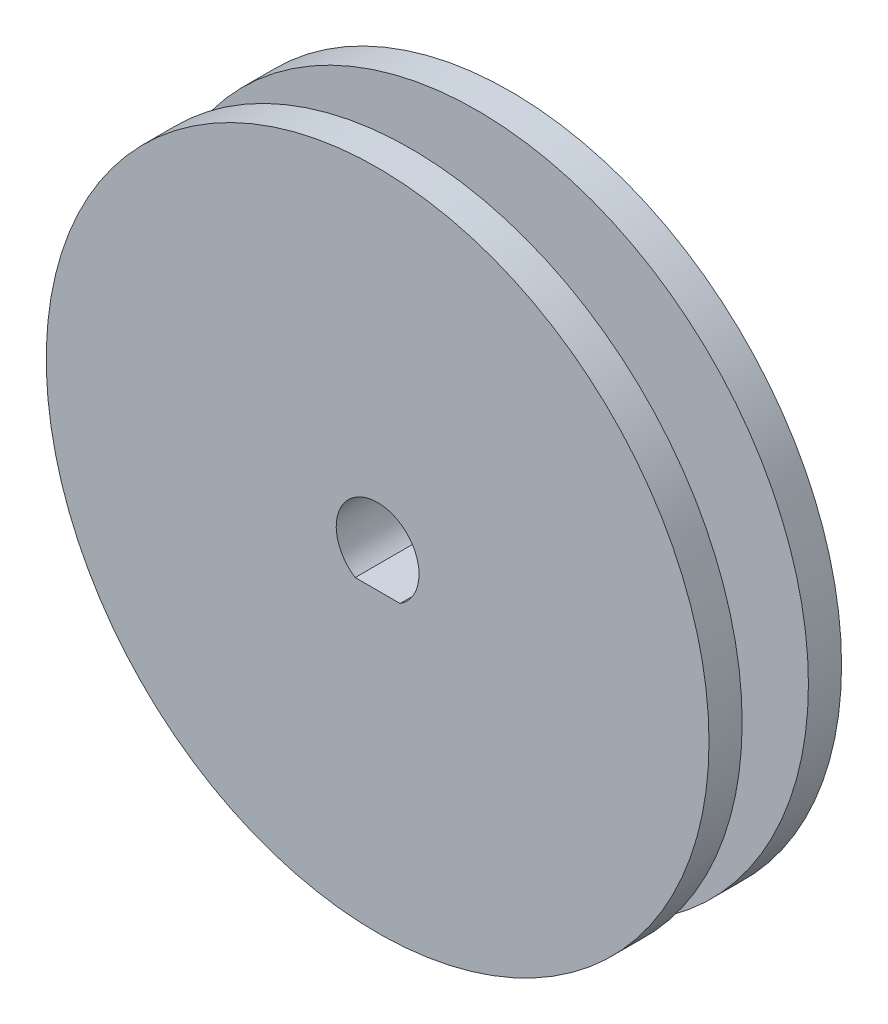
ISO-10303-21;
HEADER;
FILE_DESCRIPTION(('STEP AP214'),'2;1');
FILE_NAME('part.step','',(''),(''),'','','');
FILE_SCHEMA(('AUTOMOTIVE_DESIGN { 1 0 10303 214 1 1 1 1 }'));
ENDSEC;
DATA;
#1=APPLICATION_CONTEXT('core data for automotive mechanical design processes');
#2=APPLICATION_PROTOCOL_DEFINITION('international standard','automotive_design',2000,#1);
#3=PRODUCT_CONTEXT('',#1,'mechanical');
#4=PRODUCT('Part','Part','',(#3));
#5=PRODUCT_RELATED_PRODUCT_CATEGORY('part','',(#4));
#6=PRODUCT_DEFINITION_FORMATION('','',#4);
#7=PRODUCT_DEFINITION_CONTEXT('part definition',#1,'design');
#8=PRODUCT_DEFINITION('design','',#6,#7);
#9=PRODUCT_DEFINITION_SHAPE('','',#8);
#10=(LENGTH_UNIT() NAMED_UNIT(*) SI_UNIT(.MILLI.,.METRE.));
#11=(NAMED_UNIT(*) PLANE_ANGLE_UNIT() SI_UNIT($,.RADIAN.));
#12=(NAMED_UNIT(*) SI_UNIT($,.STERADIAN.) SOLID_ANGLE_UNIT());
#13=UNCERTAINTY_MEASURE_WITH_UNIT(LENGTH_MEASURE(1.E-05),#10,'distance_accuracy_value','');
#14=(GEOMETRIC_REPRESENTATION_CONTEXT(3) GLOBAL_UNCERTAINTY_ASSIGNED_CONTEXT((#13)) GLOBAL_UNIT_ASSIGNED_CONTEXT((#10,
#11,#12)) REPRESENTATION_CONTEXT('',''));
#15=CARTESIAN_POINT('',(0.,0.,0.));
#16=DIRECTION('',(0.,0.,1.));
#17=DIRECTION('',(1.,0.,0.));
#18=AXIS2_PLACEMENT_3D('',#15,#16,#17);
#19=CARTESIAN_POINT('',(0.,0.,2.));
#20=DIRECTION('',(0.,0.,-1.));
#21=DIRECTION('',(-1.,0.,0.));
#22=AXIS2_PLACEMENT_3D('',#19,#20,#21);
#23=CYLINDRICAL_SURFACE('',#22,20.);
#24=CARTESIAN_POINT('',(0.,0.,2.));
#25=DIRECTION('',(0.,0.,1.));
#26=DIRECTION('',(1.,0.,0.));
#27=AXIS2_PLACEMENT_3D('',#24,#25,#26);
#28=CIRCLE('',#27,20.);
#29=CARTESIAN_POINT('',(20.,0.,2.));
#30=VERTEX_POINT('',#29);
#31=EDGE_CURVE('E52',#30,#30,#28,.T.);
#32=ORIENTED_EDGE('',*,*,#31,.F.);
#33=EDGE_LOOP('',(#32));
#34=FACE_BOUND('',#33,.T.);
#35=CARTESIAN_POINT('',(0.,0.,0.));
#36=DIRECTION('',(0.,0.,1.));
#37=DIRECTION('',(1.,0.,0.));
#38=AXIS2_PLACEMENT_3D('',#35,#36,#37);
#39=CIRCLE('',#38,20.);
#40=CARTESIAN_POINT('',(20.,0.,0.));
#41=VERTEX_POINT('',#40);
#42=EDGE_CURVE('E46',#41,#41,#39,.T.);
#43=ORIENTED_EDGE('',*,*,#42,.T.);
#44=EDGE_LOOP('',(#43));
#45=FACE_BOUND('',#44,.T.);
#46=ADVANCED_FACE('F43',(#34,#45),#23,.T.);
#47=CARTESIAN_POINT('',(0.,0.,2.));
#48=DIRECTION('',(0.,0.,1.));
#49=DIRECTION('',(1.,0.,0.));
#50=AXIS2_PLACEMENT_3D('',#47,#48,#49);
#51=PLANE('',#50);
#52=CARTESIAN_POINT('',(0.03953200340992,11.6817070076302,2.));
#53=DIRECTION('',(0.,0.,1.));
#54=DIRECTION('',(1.,0.,0.));
#55=AXIS2_PLACEMENT_3D('',#52,#53,#54);
#56=CIRCLE('',#55,1.);
#57=CARTESIAN_POINT('',(1.03953200340992,11.6817070076302,2.));
#58=VERTEX_POINT('',#57);
#59=EDGE_CURVE('E100',#58,#58,#56,.T.);
#60=ORIENTED_EDGE('',*,*,#59,.F.);
#61=EDGE_LOOP('',(#60));
#62=FACE_BOUND('',#61,.T.);
#63=CARTESIAN_POINT('',(0.,0.,2.));
#64=DIRECTION('',(0.,0.,1.));
#65=DIRECTION('',(1.,0.,0.));
#66=AXIS2_PLACEMENT_3D('',#63,#64,#65);
#67=CIRCLE('',#66,10.);
#68=CARTESIAN_POINT('',(10.,0.,2.));
#69=VERTEX_POINT('',#68);
#70=EDGE_CURVE('E11',#69,#69,#67,.T.);
#71=ORIENTED_EDGE('',*,*,#70,.F.);
#72=EDGE_LOOP('',(#71));
#73=FACE_BOUND('',#72,.T.);
#74=ORIENTED_EDGE('',*,*,#31,.T.);
#75=EDGE_LOOP('',(#74));
#76=FACE_BOUND('',#75,.T.);
#77=ADVANCED_FACE('F126',(#62,#73,#76),#51,.T.);
#78=CARTESIAN_POINT('',(0.,0.,0.));
#79=DIRECTION('',(0.,0.,1.));
#80=DIRECTION('',(1.,0.,0.));
#81=AXIS2_PLACEMENT_3D('',#78,#79,#80);
#82=PLANE('',#81);
#83=DIRECTION('',(1.,0.,0.));
#84=VECTOR('',#83,1.);
#85=CARTESIAN_POINT('',(-1.35646599662505,-2.1,0.));
#86=LINE('',#85,#84);
#87=CARTESIAN_POINT('',(-1.35646599662505,-2.1,0.));
#88=VERTEX_POINT('',#87);
#89=CARTESIAN_POINT('',(1.35646599662505,-2.1,0.));
#90=VERTEX_POINT('',#89);
#91=EDGE_CURVE('E91',#88,#90,#86,.T.);
#92=ORIENTED_EDGE('',*,*,#91,.T.);
#93=CARTESIAN_POINT('',(0.,0.,0.));
#94=DIRECTION('',(0.,0.,1.));
#95=DIRECTION('',(1.,0.,0.));
#96=AXIS2_PLACEMENT_3D('',#93,#94,#95);
#97=CIRCLE('',#96,2.5);
#98=EDGE_CURVE('E60',#90,#88,#97,.T.);
#99=ORIENTED_EDGE('',*,*,#98,.T.);
#100=EDGE_LOOP('',(#92,#99));
#101=FACE_BOUND('',#100,.T.);
#102=ORIENTED_EDGE('',*,*,#42,.F.);
#103=EDGE_LOOP('',(#102));
#104=FACE_BOUND('',#103,.T.);
#105=ADVANCED_FACE('F123',(#101,#104),#82,.F.);
#106=CARTESIAN_POINT('',(0.,0.,6.));
#107=DIRECTION('',(0.,0.,-1.));
#108=DIRECTION('',(-1.,0.,0.));
#109=AXIS2_PLACEMENT_3D('',#106,#107,#108);
#110=CYLINDRICAL_SURFACE('',#109,10.);
#111=CARTESIAN_POINT('',(0.,0.,6.));
#112=DIRECTION('',(0.,0.,1.));
#113=DIRECTION('',(1.,0.,0.));
#114=AXIS2_PLACEMENT_3D('',#111,#112,#113);
#115=CIRCLE('',#114,10.);
#116=CARTESIAN_POINT('',(10.,0.,6.));
#117=VERTEX_POINT('',#116);
#118=EDGE_CURVE('E108',#117,#117,#115,.T.);
#119=ORIENTED_EDGE('',*,*,#118,.F.);
#120=EDGE_LOOP('',(#119));
#121=FACE_BOUND('',#120,.T.);
#122=ORIENTED_EDGE('',*,*,#70,.T.);
#123=EDGE_LOOP('',(#122));
#124=FACE_BOUND('',#123,.T.);
#125=ADVANCED_FACE('F125',(#121,#124),#110,.T.);
#126=CARTESIAN_POINT('',(0.03953200340992,11.6817070076302,6.));
#127=DIRECTION('',(0.,0.,-1.));
#128=DIRECTION('',(-1.,0.,0.));
#129=AXIS2_PLACEMENT_3D('',#126,#127,#128);
#130=CYLINDRICAL_SURFACE('',#129,1.);
#131=CARTESIAN_POINT('',(0.03953200340992,11.6817070076302,6.));
#132=DIRECTION('',(0.,0.,1.));
#133=DIRECTION('',(1.,0.,0.));
#134=AXIS2_PLACEMENT_3D('',#131,#132,#133);
#135=CIRCLE('',#134,1.);
#136=CARTESIAN_POINT('',(1.03953200340992,11.6817070076302,6.));
#137=VERTEX_POINT('',#136);
#138=EDGE_CURVE('E104',#137,#137,#135,.T.);
#139=ORIENTED_EDGE('',*,*,#138,.F.);
#140=EDGE_LOOP('',(#139));
#141=FACE_BOUND('',#140,.T.);
#142=ORIENTED_EDGE('',*,*,#59,.T.);
#143=EDGE_LOOP('',(#142));
#144=FACE_BOUND('',#143,.T.);
#145=ADVANCED_FACE('F132',(#141,#144),#130,.T.);
#146=CARTESIAN_POINT('',(0.,0.,6.));
#147=DIRECTION('',(0.,0.,1.));
#148=DIRECTION('',(1.,0.,0.));
#149=AXIS2_PLACEMENT_3D('',#146,#147,#148);
#150=CYLINDRICAL_SURFACE('',#149,20.);
#151=CARTESIAN_POINT('',(0.,0.,6.));
#152=DIRECTION('',(0.,0.,1.));
#153=DIRECTION('',(1.,0.,0.));
#154=AXIS2_PLACEMENT_3D('',#151,#152,#153);
#155=CIRCLE('',#154,20.);
#156=CARTESIAN_POINT('',(20.,0.,6.));
#157=VERTEX_POINT('',#156);
#158=EDGE_CURVE('E96',#157,#157,#155,.T.);
#159=ORIENTED_EDGE('',*,*,#158,.T.);
#160=EDGE_LOOP('',(#159));
#161=FACE_BOUND('',#160,.T.);
#162=CARTESIAN_POINT('',(0.,0.,8.));
#163=DIRECTION('',(0.,0.,1.));
#164=DIRECTION('',(1.,0.,0.));
#165=AXIS2_PLACEMENT_3D('',#162,#163,#164);
#166=CIRCLE('',#165,20.);
#167=CARTESIAN_POINT('',(20.,0.,8.));
#168=VERTEX_POINT('',#167);
#169=EDGE_CURVE('E77',#168,#168,#166,.T.);
#170=ORIENTED_EDGE('',*,*,#169,.F.);
#171=EDGE_LOOP('',(#170));
#172=FACE_BOUND('',#171,.T.);
#173=ADVANCED_FACE('F159',(#161,#172),#150,.T.);
#174=CARTESIAN_POINT('',(0.,0.,6.));
#175=DIRECTION('',(0.,0.,-1.));
#176=DIRECTION('',(1.,0.,0.));
#177=AXIS2_PLACEMENT_3D('',#174,#175,#176);
#178=PLANE('',#177);
#179=ORIENTED_EDGE('',*,*,#118,.T.);
#180=EDGE_LOOP('',(#179));
#181=FACE_BOUND('',#180,.T.);
#182=ORIENTED_EDGE('',*,*,#138,.T.);
#183=EDGE_LOOP('',(#182));
#184=FACE_BOUND('',#183,.T.);
#185=ORIENTED_EDGE('',*,*,#158,.F.);
#186=EDGE_LOOP('',(#185));
#187=FACE_BOUND('',#186,.T.);
#188=ADVANCED_FACE('F170',(#181,#184,#187),#178,.T.);
#189=CARTESIAN_POINT('',(0.,0.,8.));
#190=DIRECTION('',(0.,0.,-1.));
#191=DIRECTION('',(1.,0.,0.));
#192=AXIS2_PLACEMENT_3D('',#189,#190,#191);
#193=PLANE('',#192);
#194=DIRECTION('',(1.,0.,0.));
#195=VECTOR('',#194,1.);
#196=CARTESIAN_POINT('',(-1.35646599662505,-2.1,8.));
#197=LINE('',#196,#195);
#198=CARTESIAN_POINT('',(-1.35646599662505,-2.1,8.));
#199=VERTEX_POINT('',#198);
#200=CARTESIAN_POINT('',(1.35646599662505,-2.1,8.));
#201=VERTEX_POINT('',#200);
#202=EDGE_CURVE('E81',#199,#201,#197,.T.);
#203=ORIENTED_EDGE('',*,*,#202,.F.);
#204=CARTESIAN_POINT('',(0.,0.,8.));
#205=DIRECTION('',(0.,0.,1.));
#206=DIRECTION('',(1.,0.,0.));
#207=AXIS2_PLACEMENT_3D('',#204,#205,#206);
#208=CIRCLE('',#207,2.5);
#209=EDGE_CURVE('E65',#201,#199,#208,.T.);
#210=ORIENTED_EDGE('',*,*,#209,.F.);
#211=EDGE_LOOP('',(#203,#210));
#212=FACE_BOUND('',#211,.T.);
#213=ORIENTED_EDGE('',*,*,#169,.T.);
#214=EDGE_LOOP('',(#213));
#215=FACE_BOUND('',#214,.T.);
#216=ADVANCED_FACE('F86',(#212,#215),#193,.F.);
#217=CARTESIAN_POINT('',(0.,0.,0.));
#218=DIRECTION('',(0.,0.,1.));
#219=DIRECTION('',(1.,0.,0.));
#220=AXIS2_PLACEMENT_3D('',#217,#218,#219);
#221=CYLINDRICAL_SURFACE('',#220,2.5);
#222=ORIENTED_EDGE('',*,*,#209,.T.);
#223=DIRECTION('',(0.,0.,1.));
#224=VECTOR('',#223,1.);
#225=CARTESIAN_POINT('',(-1.35646599662505,-2.1,0.));
#226=LINE('',#225,#224);
#227=EDGE_CURVE('E78',#88,#199,#226,.T.);
#228=ORIENTED_EDGE('',*,*,#227,.F.);
#229=ORIENTED_EDGE('',*,*,#98,.F.);
#230=DIRECTION('',(0.,0.,1.));
#231=VECTOR('',#230,1.);
#232=CARTESIAN_POINT('',(1.35646599662505,-2.1,0.));
#233=LINE('',#232,#231);
#234=EDGE_CURVE('E70',#90,#201,#233,.T.);
#235=ORIENTED_EDGE('',*,*,#234,.T.);
#236=EDGE_LOOP('',(#222,#228,#229,#235));
#237=FACE_BOUND('',#236,.T.);
#238=ADVANCED_FACE('F72',(#237),#221,.F.);
#239=CARTESIAN_POINT('',(-1.35646599662505,-2.1,0.));
#240=DIRECTION('',(0.,-1.,0.));
#241=DIRECTION('',(0.,0.,-1.));
#242=AXIS2_PLACEMENT_3D('',#239,#240,#241);
#243=PLANE('',#242);
#244=ORIENTED_EDGE('',*,*,#202,.T.);
#245=ORIENTED_EDGE('',*,*,#234,.F.);
#246=ORIENTED_EDGE('',*,*,#91,.F.);
#247=ORIENTED_EDGE('',*,*,#227,.T.);
#248=EDGE_LOOP('',(#244,#245,#246,#247));
#249=FACE_BOUND('',#248,.T.);
#250=ADVANCED_FACE('F82',(#249),#243,.F.);
#251=CLOSED_SHELL('',(#46,#77,#105,#125,#145,#173,#188,#216,#238,#250));
#252=MANIFOLD_SOLID_BREP('B2',#251);
#253=ADVANCED_BREP_SHAPE_REPRESENTATION('',(#18,#252),#14);
#254=SHAPE_DEFINITION_REPRESENTATION(#9,#253);
ENDSEC;
END-ISO-10303-21;
